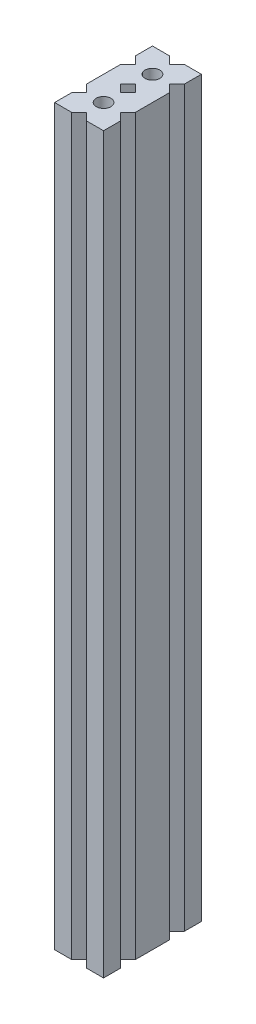
ISO-10303-21;
HEADER;
FILE_DESCRIPTION(('STEP AP214'),'2;1');
FILE_NAME('part.step','',(''),(''),'','','');
FILE_SCHEMA(('AUTOMOTIVE_DESIGN { 1 0 10303 214 1 1 1 1 }'));
ENDSEC;
DATA;
#1=APPLICATION_CONTEXT('core data for automotive mechanical design processes');
#2=APPLICATION_PROTOCOL_DEFINITION('international standard','automotive_design',2000,#1);
#3=PRODUCT_CONTEXT('',#1,'mechanical');
#4=PRODUCT('Part','Part','',(#3));
#5=PRODUCT_RELATED_PRODUCT_CATEGORY('part','',(#4));
#6=PRODUCT_DEFINITION_FORMATION('','',#4);
#7=PRODUCT_DEFINITION_CONTEXT('part definition',#1,'design');
#8=PRODUCT_DEFINITION('design','',#6,#7);
#9=PRODUCT_DEFINITION_SHAPE('','',#8);
#10=(LENGTH_UNIT() NAMED_UNIT(*) SI_UNIT(.MILLI.,.METRE.));
#11=(NAMED_UNIT(*) PLANE_ANGLE_UNIT() SI_UNIT($,.RADIAN.));
#12=(NAMED_UNIT(*) SI_UNIT($,.STERADIAN.) SOLID_ANGLE_UNIT());
#13=UNCERTAINTY_MEASURE_WITH_UNIT(LENGTH_MEASURE(1.E-05),#10,'distance_accuracy_value','');
#14=(GEOMETRIC_REPRESENTATION_CONTEXT(3) GLOBAL_UNCERTAINTY_ASSIGNED_CONTEXT((#13)) GLOBAL_UNIT_ASSIGNED_CONTEXT((#10,
#11,#12)) REPRESENTATION_CONTEXT('',''));
#15=CARTESIAN_POINT('',(0.,0.,0.));
#16=DIRECTION('',(0.,0.,1.));
#17=DIRECTION('',(1.,0.,0.));
#18=AXIS2_PLACEMENT_3D('',#15,#16,#17);
#19=CARTESIAN_POINT('',(20.,300.,0.));
#20=DIRECTION('',(0.,0.,-1.));
#21=DIRECTION('',(-1.,0.,0.));
#22=AXIS2_PLACEMENT_3D('',#19,#20,#21);
#23=PLANE('',#22);
#24=DIRECTION('',(0.,1.,0.));
#25=VECTOR('',#24,1.);
#26=CARTESIAN_POINT('',(7.,0.,0.));
#27=LINE('',#26,#25);
#28=CARTESIAN_POINT('',(7.,0.,0.));
#29=VERTEX_POINT('',#28);
#30=CARTESIAN_POINT('',(7.,300.,0.));
#31=VERTEX_POINT('',#30);
#32=EDGE_CURVE('E334',#29,#31,#27,.T.);
#33=ORIENTED_EDGE('',*,*,#32,.T.);
#34=DIRECTION('',(1.,0.,0.));
#35=VECTOR('',#34,1.);
#36=CARTESIAN_POINT('',(20.,300.,0.));
#37=LINE('',#36,#35);
#38=CARTESIAN_POINT('',(0.,300.,0.));
#39=VERTEX_POINT('',#38);
#40=EDGE_CURVE('E262',#39,#31,#37,.T.);
#41=ORIENTED_EDGE('',*,*,#40,.F.);
#42=DIRECTION('',(0.,-1.,0.));
#43=VECTOR('',#42,1.);
#44=CARTESIAN_POINT('',(0.,300.,0.));
#45=LINE('',#44,#43);
#46=CARTESIAN_POINT('',(0.,0.,0.));
#47=VERTEX_POINT('',#46);
#48=EDGE_CURVE('E289',#39,#47,#45,.T.);
#49=ORIENTED_EDGE('',*,*,#48,.T.);
#50=DIRECTION('',(1.,0.,0.));
#51=VECTOR('',#50,1.);
#52=CARTESIAN_POINT('',(20.,0.,0.));
#53=LINE('',#52,#51);
#54=EDGE_CURVE('E236',#47,#29,#53,.T.);
#55=ORIENTED_EDGE('',*,*,#54,.T.);
#56=EDGE_LOOP('',(#33,#41,#49,#55));
#57=FACE_BOUND('',#56,.T.);
#58=ADVANCED_FACE('F35',(#57),#23,.F.);
#59=CARTESIAN_POINT('',(20.,300.,-40.));
#60=DIRECTION('',(-1.,0.,0.));
#61=DIRECTION('',(0.,0.,1.));
#62=AXIS2_PLACEMENT_3D('',#59,#60,#61);
#63=PLANE('',#62);
#64=DIRECTION('',(0.,1.,0.));
#65=VECTOR('',#64,1.);
#66=CARTESIAN_POINT('',(20.,0.,-27.));
#67=LINE('',#66,#65);
#68=CARTESIAN_POINT('',(20.,0.,-27.));
#69=VERTEX_POINT('',#68);
#70=CARTESIAN_POINT('',(20.,300.,-27.));
#71=VERTEX_POINT('',#70);
#72=EDGE_CURVE('E353',#69,#71,#67,.T.);
#73=ORIENTED_EDGE('',*,*,#72,.T.);
#74=DIRECTION('',(0.,0.,-1.));
#75=VECTOR('',#74,1.);
#76=CARTESIAN_POINT('',(20.,300.,-40.));
#77=LINE('',#76,#75);
#78=CARTESIAN_POINT('',(20.,300.,-13.));
#79=VERTEX_POINT('',#78);
#80=EDGE_CURVE('E282',#79,#71,#77,.T.);
#81=ORIENTED_EDGE('',*,*,#80,.F.);
#82=DIRECTION('',(0.,1.,0.));
#83=VECTOR('',#82,1.);
#84=CARTESIAN_POINT('',(20.,0.,-13.));
#85=LINE('',#84,#83);
#86=CARTESIAN_POINT('',(20.,0.,-13.));
#87=VERTEX_POINT('',#86);
#88=EDGE_CURVE('E416',#87,#79,#85,.T.);
#89=ORIENTED_EDGE('',*,*,#88,.F.);
#90=DIRECTION('',(0.,0.,-1.));
#91=VECTOR('',#90,1.);
#92=CARTESIAN_POINT('',(20.,0.,-40.));
#93=LINE('',#92,#91);
#94=EDGE_CURVE('E298',#87,#69,#93,.T.);
#95=ORIENTED_EDGE('',*,*,#94,.T.);
#96=EDGE_LOOP('',(#73,#81,#89,#95));
#97=FACE_BOUND('',#96,.T.);
#98=ADVANCED_FACE('F507',(#97),#63,.F.);
#99=DIRECTION('',(0.,1.,0.));
#100=VECTOR('',#99,1.);
#101=CARTESIAN_POINT('',(20.,0.,-7.00000000000001));
#102=LINE('',#101,#100);
#103=CARTESIAN_POINT('',(20.,0.,-7.00000000000001));
#104=VERTEX_POINT('',#103);
#105=CARTESIAN_POINT('',(20.,300.,-7.00000000000001));
#106=VERTEX_POINT('',#105);
#107=EDGE_CURVE('E406',#104,#106,#102,.T.);
#108=ORIENTED_EDGE('',*,*,#107,.T.);
#109=CARTESIAN_POINT('',(20.,300.,0.));
#110=VERTEX_POINT('',#109);
#111=EDGE_CURVE('E278',#110,#106,#77,.T.);
#112=ORIENTED_EDGE('',*,*,#111,.F.);
#113=DIRECTION('',(0.,-1.,0.));
#114=VECTOR('',#113,1.);
#115=CARTESIAN_POINT('',(20.,300.,0.));
#116=LINE('',#115,#114);
#117=CARTESIAN_POINT('',(20.,0.,0.));
#118=VERTEX_POINT('',#117);
#119=EDGE_CURVE('E11',#110,#118,#116,.T.);
#120=ORIENTED_EDGE('',*,*,#119,.T.);
#121=EDGE_CURVE('E295',#118,#104,#93,.T.);
#122=ORIENTED_EDGE('',*,*,#121,.T.);
#123=EDGE_LOOP('',(#108,#112,#120,#122));
#124=FACE_BOUND('',#123,.T.);
#125=ADVANCED_FACE('F730',(#124),#63,.F.);
#126=CARTESIAN_POINT('',(0.,300.,-40.));
#127=DIRECTION('',(0.,0.,1.));
#128=DIRECTION('',(1.,0.,0.));
#129=AXIS2_PLACEMENT_3D('',#126,#127,#128);
#130=PLANE('',#129);
#131=DIRECTION('',(0.,1.,0.));
#132=VECTOR('',#131,1.);
#133=CARTESIAN_POINT('',(13.,0.,-40.));
#134=LINE('',#133,#132);
#135=CARTESIAN_POINT('',(13.,0.,-40.));
#136=VERTEX_POINT('',#135);
#137=CARTESIAN_POINT('',(13.,300.,-40.));
#138=VERTEX_POINT('',#137);
#139=EDGE_CURVE('E329',#136,#138,#134,.T.);
#140=ORIENTED_EDGE('',*,*,#139,.T.);
#141=DIRECTION('',(-1.,0.,0.));
#142=VECTOR('',#141,1.);
#143=CARTESIAN_POINT('',(0.,300.,-40.));
#144=LINE('',#143,#142);
#145=CARTESIAN_POINT('',(20.,300.,-40.));
#146=VERTEX_POINT('',#145);
#147=EDGE_CURVE('E283',#146,#138,#144,.T.);
#148=ORIENTED_EDGE('',*,*,#147,.F.);
#149=DIRECTION('',(0.,-1.,0.));
#150=VECTOR('',#149,1.);
#151=CARTESIAN_POINT('',(20.,300.,-40.));
#152=LINE('',#151,#150);
#153=CARTESIAN_POINT('',(20.,0.,-40.));
#154=VERTEX_POINT('',#153);
#155=EDGE_CURVE('E44',#146,#154,#152,.T.);
#156=ORIENTED_EDGE('',*,*,#155,.T.);
#157=DIRECTION('',(-1.,0.,0.));
#158=VECTOR('',#157,1.);
#159=CARTESIAN_POINT('',(0.,0.,-40.));
#160=LINE('',#159,#158);
#161=EDGE_CURVE('E239',#154,#136,#160,.T.);
#162=ORIENTED_EDGE('',*,*,#161,.T.);
#163=EDGE_LOOP('',(#140,#148,#156,#162));
#164=FACE_BOUND('',#163,.T.);
#165=ADVANCED_FACE('F319',(#164),#130,.F.);
#166=CARTESIAN_POINT('',(0.,300.,0.));
#167=DIRECTION('',(1.,0.,0.));
#168=DIRECTION('',(0.,0.,-1.));
#169=AXIS2_PLACEMENT_3D('',#166,#167,#168);
#170=PLANE('',#169);
#171=DIRECTION('',(0.,1.,0.));
#172=VECTOR('',#171,1.);
#173=CARTESIAN_POINT('',(0.,0.,-13.));
#174=LINE('',#173,#172);
#175=CARTESIAN_POINT('',(0.,0.,-13.));
#176=VERTEX_POINT('',#175);
#177=CARTESIAN_POINT('',(0.,300.,-13.));
#178=VERTEX_POINT('',#177);
#179=EDGE_CURVE('E411',#176,#178,#174,.T.);
#180=ORIENTED_EDGE('',*,*,#179,.T.);
#181=DIRECTION('',(0.,0.,1.));
#182=VECTOR('',#181,1.);
#183=CARTESIAN_POINT('',(0.,300.,0.));
#184=LINE('',#183,#182);
#185=CARTESIAN_POINT('',(0.,300.,-27.));
#186=VERTEX_POINT('',#185);
#187=EDGE_CURVE('E290',#186,#178,#184,.T.);
#188=ORIENTED_EDGE('',*,*,#187,.F.);
#189=DIRECTION('',(0.,1.,0.));
#190=VECTOR('',#189,1.);
#191=CARTESIAN_POINT('',(0.,0.,-27.));
#192=LINE('',#191,#190);
#193=CARTESIAN_POINT('',(0.,0.,-27.));
#194=VERTEX_POINT('',#193);
#195=EDGE_CURVE('E434',#194,#186,#192,.T.);
#196=ORIENTED_EDGE('',*,*,#195,.F.);
#197=DIRECTION('',(0.,0.,1.));
#198=VECTOR('',#197,1.);
#199=CARTESIAN_POINT('',(0.,0.,0.));
#200=LINE('',#199,#198);
#201=EDGE_CURVE('E238',#194,#176,#200,.T.);
#202=ORIENTED_EDGE('',*,*,#201,.T.);
#203=EDGE_LOOP('',(#180,#188,#196,#202));
#204=FACE_BOUND('',#203,.T.);
#205=ADVANCED_FACE('F471',(#204),#170,.F.);
#206=DIRECTION('',(0.,1.,0.));
#207=VECTOR('',#206,1.);
#208=CARTESIAN_POINT('',(0.,0.,-33.));
#209=LINE('',#208,#207);
#210=CARTESIAN_POINT('',(0.,0.,-33.));
#211=VERTEX_POINT('',#210);
#212=CARTESIAN_POINT('',(0.,300.,-33.));
#213=VERTEX_POINT('',#212);
#214=EDGE_CURVE('E276',#211,#213,#209,.T.);
#215=ORIENTED_EDGE('',*,*,#214,.T.);
#216=CARTESIAN_POINT('',(0.,300.,-40.));
#217=VERTEX_POINT('',#216);
#218=EDGE_CURVE('E286',#217,#213,#184,.T.);
#219=ORIENTED_EDGE('',*,*,#218,.F.);
#220=DIRECTION('',(0.,-1.,0.));
#221=VECTOR('',#220,1.);
#222=CARTESIAN_POINT('',(0.,300.,-40.));
#223=LINE('',#222,#221);
#224=CARTESIAN_POINT('',(0.,0.,-40.));
#225=VERTEX_POINT('',#224);
#226=EDGE_CURVE('E321',#217,#225,#223,.T.);
#227=ORIENTED_EDGE('',*,*,#226,.T.);
#228=EDGE_CURVE('E241',#225,#211,#200,.T.);
#229=ORIENTED_EDGE('',*,*,#228,.T.);
#230=EDGE_LOOP('',(#215,#219,#227,#229));
#231=FACE_BOUND('',#230,.T.);
#232=ADVANCED_FACE('F443',(#231),#170,.F.);
#233=CARTESIAN_POINT('',(0.,300.,0.));
#234=DIRECTION('',(0.,-1.,0.));
#235=DIRECTION('',(0.,0.,-1.));
#236=AXIS2_PLACEMENT_3D('',#233,#234,#235);
#237=PLANE('',#236);
#238=CARTESIAN_POINT('',(10.,300.,-10.));
#239=DIRECTION('',(0.,-1.,0.));
#240=DIRECTION('',(0.,0.,-1.));
#241=AXIS2_PLACEMENT_3D('',#238,#239,#240);
#242=CIRCLE('',#241,3.);
#243=CARTESIAN_POINT('',(10.,300.,-13.));
#244=VERTEX_POINT('',#243);
#245=EDGE_CURVE('E490',#244,#244,#242,.T.);
#246=ORIENTED_EDGE('',*,*,#245,.T.);
#247=EDGE_LOOP('',(#246));
#248=FACE_BOUND('',#247,.T.);
#249=CARTESIAN_POINT('',(10.,300.,-30.));
#250=DIRECTION('',(0.,-1.,0.));
#251=DIRECTION('',(0.,0.,1.));
#252=AXIS2_PLACEMENT_3D('',#249,#250,#251);
#253=CIRCLE('',#252,3.);
#254=CARTESIAN_POINT('',(10.,300.,-27.));
#255=VERTEX_POINT('',#254);
#256=EDGE_CURVE('E844',#255,#255,#253,.T.);
#257=ORIENTED_EDGE('',*,*,#256,.T.);
#258=EDGE_LOOP('',(#257));
#259=FACE_BOUND('',#258,.T.);
#260=DIRECTION('',(-0.707106781186549,0.,0.707106781186546));
#261=VECTOR('',#260,1.);
#262=CARTESIAN_POINT('',(-3.50000000000002,300.,-3.50000000000004));
#263=LINE('',#262,#261);
#264=CARTESIAN_POINT('',(13.,300.,-20.));
#265=VERTEX_POINT('',#264);
#266=CARTESIAN_POINT('',(10.,300.,-17.));
#267=VERTEX_POINT('',#266);
#268=EDGE_CURVE('E51',#265,#267,#263,.T.);
#269=ORIENTED_EDGE('',*,*,#268,.T.);
#270=DIRECTION('',(0.707106781186548,0.,0.707106781186547));
#271=VECTOR('',#270,1.);
#272=CARTESIAN_POINT('',(13.5,300.,-13.5));
#273=LINE('',#272,#271);
#274=CARTESIAN_POINT('',(7.,300.,-20.));
#275=VERTEX_POINT('',#274);
#276=EDGE_CURVE('E369',#275,#267,#273,.T.);
#277=ORIENTED_EDGE('',*,*,#276,.F.);
#278=DIRECTION('',(0.707106781186546,0.,-0.707106781186549));
#279=VECTOR('',#278,1.);
#280=CARTESIAN_POINT('',(-6.49999999999998,300.,-6.49999999999994));
#281=LINE('',#280,#279);
#282=CARTESIAN_POINT('',(10.,300.,-23.));
#283=VERTEX_POINT('',#282);
#284=EDGE_CURVE('E384',#275,#283,#281,.T.);
#285=ORIENTED_EDGE('',*,*,#284,.T.);
#286=DIRECTION('',(-0.707106781186546,0.,-0.707106781186549));
#287=VECTOR('',#286,1.);
#288=CARTESIAN_POINT('',(16.5,300.,-16.5));
#289=LINE('',#288,#287);
#290=EDGE_CURVE('E380',#265,#283,#289,.T.);
#291=ORIENTED_EDGE('',*,*,#290,.F.);
#292=EDGE_LOOP('',(#269,#277,#285,#291));
#293=FACE_BOUND('',#292,.T.);
#294=DIRECTION('',(-0.707106781186547,0.,0.707106781186548));
#295=VECTOR('',#294,1.);
#296=CARTESIAN_POINT('',(-13.5,300.,-13.5));
#297=LINE('',#296,#295);
#298=CARTESIAN_POINT('',(10.,300.,-37.));
#299=VERTEX_POINT('',#298);
#300=EDGE_CURVE('E331',#138,#299,#297,.T.);
#301=ORIENTED_EDGE('',*,*,#300,.T.);
#302=DIRECTION('',(0.707106781186547,0.,0.707106781186548));
#303=VECTOR('',#302,1.);
#304=CARTESIAN_POINT('',(23.5,300.,-23.5));
#305=LINE('',#304,#303);
#306=CARTESIAN_POINT('',(6.99999999999999,300.,-40.));
#307=VERTEX_POINT('',#306);
#308=EDGE_CURVE('E327',#307,#299,#305,.T.);
#309=ORIENTED_EDGE('',*,*,#308,.F.);
#310=EDGE_CURVE('E281',#307,#217,#144,.T.);
#311=ORIENTED_EDGE('',*,*,#310,.T.);
#312=ORIENTED_EDGE('',*,*,#218,.T.);
#313=DIRECTION('',(0.707106781186549,0.,0.707106781186546));
#314=VECTOR('',#313,1.);
#315=CARTESIAN_POINT('',(16.5,300.,-16.5));
#316=LINE('',#315,#314);
#317=CARTESIAN_POINT('',(3.,300.,-30.));
#318=VERTEX_POINT('',#317);
#319=EDGE_CURVE('E341',#213,#318,#316,.T.);
#320=ORIENTED_EDGE('',*,*,#319,.T.);
#321=DIRECTION('',(0.707106781186548,0.,-0.707106781186547));
#322=VECTOR('',#321,1.);
#323=CARTESIAN_POINT('',(-13.5,300.,-13.5));
#324=LINE('',#323,#322);
#325=EDGE_CURVE('E425',#186,#318,#324,.T.);
#326=ORIENTED_EDGE('',*,*,#325,.F.);
#327=ORIENTED_EDGE('',*,*,#187,.T.);
#328=DIRECTION('',(0.707106781186548,0.,0.707106781186547));
#329=VECTOR('',#328,1.);
#330=CARTESIAN_POINT('',(6.5,300.,-6.5));
#331=LINE('',#330,#329);
#332=CARTESIAN_POINT('',(3.,300.,-10.));
#333=VERTEX_POINT('',#332);
#334=EDGE_CURVE('E220',#178,#333,#331,.T.);
#335=ORIENTED_EDGE('',*,*,#334,.T.);
#336=DIRECTION('',(0.707106781186549,0.,-0.707106781186546));
#337=VECTOR('',#336,1.);
#338=CARTESIAN_POINT('',(-3.5,300.,-3.50000000000001));
#339=LINE('',#338,#337);
#340=CARTESIAN_POINT('',(0.,300.,-7.));
#341=VERTEX_POINT('',#340);
#342=EDGE_CURVE('E463',#341,#333,#339,.T.);
#343=ORIENTED_EDGE('',*,*,#342,.F.);
#344=EDGE_CURVE('E228',#341,#39,#184,.T.);
#345=ORIENTED_EDGE('',*,*,#344,.T.);
#346=ORIENTED_EDGE('',*,*,#40,.T.);
#347=DIRECTION('',(0.707106781186547,0.,-0.707106781186548));
#348=VECTOR('',#347,1.);
#349=CARTESIAN_POINT('',(3.5,300.,3.5));
#350=LINE('',#349,#348);
#351=CARTESIAN_POINT('',(10.,300.,-3.));
#352=VERTEX_POINT('',#351);
#353=EDGE_CURVE('E461',#31,#352,#350,.T.);
#354=ORIENTED_EDGE('',*,*,#353,.T.);
#355=DIRECTION('',(-0.707106781186547,0.,-0.707106781186548));
#356=VECTOR('',#355,1.);
#357=CARTESIAN_POINT('',(6.50000000000001,300.,-6.5));
#358=LINE('',#357,#356);
#359=CARTESIAN_POINT('',(13.,300.,0.));
#360=VERTEX_POINT('',#359);
#361=EDGE_CURVE('E486',#360,#352,#358,.T.);
#362=ORIENTED_EDGE('',*,*,#361,.F.);
#363=EDGE_CURVE('E253',#360,#110,#37,.T.);
#364=ORIENTED_EDGE('',*,*,#363,.T.);
#365=ORIENTED_EDGE('',*,*,#111,.T.);
#366=DIRECTION('',(-0.707106781186548,0.,-0.707106781186547));
#367=VECTOR('',#366,1.);
#368=CARTESIAN_POINT('',(13.5,300.,-13.5));
#369=LINE('',#368,#367);
#370=CARTESIAN_POINT('',(17.,300.,-10.));
#371=VERTEX_POINT('',#370);
#372=EDGE_CURVE('E407',#106,#371,#369,.T.);
#373=ORIENTED_EDGE('',*,*,#372,.T.);
#374=DIRECTION('',(-0.707106781186548,0.,0.707106781186547));
#375=VECTOR('',#374,1.);
#376=CARTESIAN_POINT('',(3.49999999999998,300.,3.49999999999999));
#377=LINE('',#376,#375);
#378=EDGE_CURVE('E403',#79,#371,#377,.T.);
#379=ORIENTED_EDGE('',*,*,#378,.F.);
#380=ORIENTED_EDGE('',*,*,#80,.T.);
#381=DIRECTION('',(-0.707106781186548,0.,-0.707106781186547));
#382=VECTOR('',#381,1.);
#383=CARTESIAN_POINT('',(23.5,300.,-23.5));
#384=LINE('',#383,#382);
#385=CARTESIAN_POINT('',(17.,300.,-30.));
#386=VERTEX_POINT('',#385);
#387=EDGE_CURVE('E354',#71,#386,#384,.T.);
#388=ORIENTED_EDGE('',*,*,#387,.T.);
#389=DIRECTION('',(-0.707106781186548,0.,0.707106781186547));
#390=VECTOR('',#389,1.);
#391=CARTESIAN_POINT('',(-6.50000000000002,300.,-6.50000000000004));
#392=LINE('',#391,#390);
#393=CARTESIAN_POINT('',(20.,300.,-33.));
#394=VERTEX_POINT('',#393);
#395=EDGE_CURVE('E351',#394,#386,#392,.T.);
#396=ORIENTED_EDGE('',*,*,#395,.F.);
#397=EDGE_CURVE('E273',#394,#146,#77,.T.);
#398=ORIENTED_EDGE('',*,*,#397,.T.);
#399=ORIENTED_EDGE('',*,*,#147,.T.);
#400=EDGE_LOOP('',(#301,#309,#311,#312,#320,#326,#327,#335,#343,#345,#346,#354,#362,#364,#365,
#373,#379,#380,#388,#396,#398,#399));
#401=FACE_BOUND('',#400,.T.);
#402=ADVANCED_FACE('F446',(#248,#259,#293,#401),#237,.F.);
#403=CARTESIAN_POINT('',(0.,0.,0.));
#404=DIRECTION('',(0.,-1.,0.));
#405=DIRECTION('',(0.,0.,-1.));
#406=AXIS2_PLACEMENT_3D('',#403,#404,#405);
#407=PLANE('',#406);
#408=CARTESIAN_POINT('',(10.,0.,-10.));
#409=DIRECTION('',(0.,-1.,0.));
#410=DIRECTION('',(0.,0.,-1.));
#411=AXIS2_PLACEMENT_3D('',#408,#409,#410);
#412=CIRCLE('',#411,3.);
#413=CARTESIAN_POINT('',(10.,0.,-13.));
#414=VERTEX_POINT('',#413);
#415=EDGE_CURVE('E847',#414,#414,#412,.T.);
#416=ORIENTED_EDGE('',*,*,#415,.F.);
#417=EDGE_LOOP('',(#416));
#418=FACE_BOUND('',#417,.T.);
#419=CARTESIAN_POINT('',(10.,0.,-30.));
#420=DIRECTION('',(0.,-1.,0.));
#421=DIRECTION('',(0.,0.,1.));
#422=AXIS2_PLACEMENT_3D('',#419,#420,#421);
#423=CIRCLE('',#422,3.);
#424=CARTESIAN_POINT('',(10.,0.,-27.));
#425=VERTEX_POINT('',#424);
#426=EDGE_CURVE('E841',#425,#425,#423,.T.);
#427=ORIENTED_EDGE('',*,*,#426,.F.);
#428=EDGE_LOOP('',(#427));
#429=FACE_BOUND('',#428,.T.);
#430=DIRECTION('',(0.707106781186548,0.,0.707106781186547));
#431=VECTOR('',#430,1.);
#432=CARTESIAN_POINT('',(13.5,0.,-13.5));
#433=LINE('',#432,#431);
#434=CARTESIAN_POINT('',(7.,0.,-20.));
#435=VERTEX_POINT('',#434);
#436=CARTESIAN_POINT('',(10.,0.,-17.));
#437=VERTEX_POINT('',#436);
#438=EDGE_CURVE('E375',#435,#437,#433,.T.);
#439=ORIENTED_EDGE('',*,*,#438,.T.);
#440=DIRECTION('',(-0.707106781186549,0.,0.707106781186546));
#441=VECTOR('',#440,1.);
#442=CARTESIAN_POINT('',(-3.50000000000002,0.,-3.50000000000004));
#443=LINE('',#442,#441);
#444=CARTESIAN_POINT('',(13.,0.,-20.));
#445=VERTEX_POINT('',#444);
#446=EDGE_CURVE('E366',#445,#437,#443,.T.);
#447=ORIENTED_EDGE('',*,*,#446,.F.);
#448=DIRECTION('',(-0.707106781186546,0.,-0.707106781186549));
#449=VECTOR('',#448,1.);
#450=CARTESIAN_POINT('',(16.5,0.,-16.5));
#451=LINE('',#450,#449);
#452=CARTESIAN_POINT('',(10.,0.,-23.));
#453=VERTEX_POINT('',#452);
#454=EDGE_CURVE('E368',#445,#453,#451,.T.);
#455=ORIENTED_EDGE('',*,*,#454,.T.);
#456=DIRECTION('',(0.707106781186546,0.,-0.707106781186549));
#457=VECTOR('',#456,1.);
#458=CARTESIAN_POINT('',(-6.49999999999998,0.,-6.49999999999994));
#459=LINE('',#458,#457);
#460=EDGE_CURVE('E372',#435,#453,#459,.T.);
#461=ORIENTED_EDGE('',*,*,#460,.F.);
#462=EDGE_LOOP('',(#439,#447,#455,#461));
#463=FACE_BOUND('',#462,.T.);
#464=DIRECTION('',(0.707106781186547,0.,0.707106781186548));
#465=VECTOR('',#464,1.);
#466=CARTESIAN_POINT('',(23.5,0.,-23.5));
#467=LINE('',#466,#465);
#468=CARTESIAN_POINT('',(6.99999999999999,0.,-40.));
#469=VERTEX_POINT('',#468);
#470=CARTESIAN_POINT('',(10.,0.,-37.));
#471=VERTEX_POINT('',#470);
#472=EDGE_CURVE('E325',#469,#471,#467,.T.);
#473=ORIENTED_EDGE('',*,*,#472,.T.);
#474=DIRECTION('',(-0.707106781186547,0.,0.707106781186548));
#475=VECTOR('',#474,1.);
#476=CARTESIAN_POINT('',(-13.5,0.,-13.5));
#477=LINE('',#476,#475);
#478=EDGE_CURVE('E323',#136,#471,#477,.T.);
#479=ORIENTED_EDGE('',*,*,#478,.F.);
#480=ORIENTED_EDGE('',*,*,#161,.F.);
#481=CARTESIAN_POINT('',(20.,0.,-33.));
#482=VERTEX_POINT('',#481);
#483=EDGE_CURVE('E293',#482,#154,#93,.T.);
#484=ORIENTED_EDGE('',*,*,#483,.F.);
#485=DIRECTION('',(-0.707106781186548,0.,0.707106781186547));
#486=VECTOR('',#485,1.);
#487=CARTESIAN_POINT('',(-6.50000000000002,0.,-6.50000000000004));
#488=LINE('',#487,#486);
#489=CARTESIAN_POINT('',(17.,0.,-30.));
#490=VERTEX_POINT('',#489);
#491=EDGE_CURVE('E350',#482,#490,#488,.T.);
#492=ORIENTED_EDGE('',*,*,#491,.T.);
#493=DIRECTION('',(-0.707106781186548,0.,-0.707106781186547));
#494=VECTOR('',#493,1.);
#495=CARTESIAN_POINT('',(23.5,0.,-23.5));
#496=LINE('',#495,#494);
#497=EDGE_CURVE('E347',#69,#490,#496,.T.);
#498=ORIENTED_EDGE('',*,*,#497,.F.);
#499=ORIENTED_EDGE('',*,*,#94,.F.);
#500=DIRECTION('',(-0.707106781186548,0.,0.707106781186547));
#501=VECTOR('',#500,1.);
#502=CARTESIAN_POINT('',(3.49999999999998,0.,3.49999999999999));
#503=LINE('',#502,#501);
#504=CARTESIAN_POINT('',(17.,0.,-10.));
#505=VERTEX_POINT('',#504);
#506=EDGE_CURVE('E402',#87,#505,#503,.T.);
#507=ORIENTED_EDGE('',*,*,#506,.T.);
#508=DIRECTION('',(-0.707106781186548,0.,-0.707106781186547));
#509=VECTOR('',#508,1.);
#510=CARTESIAN_POINT('',(13.5,0.,-13.5));
#511=LINE('',#510,#509);
#512=EDGE_CURVE('E399',#104,#505,#511,.T.);
#513=ORIENTED_EDGE('',*,*,#512,.F.);
#514=ORIENTED_EDGE('',*,*,#121,.F.);
#515=CARTESIAN_POINT('',(13.,0.,0.));
#516=VERTEX_POINT('',#515);
#517=EDGE_CURVE('E294',#516,#118,#53,.T.);
#518=ORIENTED_EDGE('',*,*,#517,.F.);
#519=DIRECTION('',(-0.707106781186547,0.,-0.707106781186548));
#520=VECTOR('',#519,1.);
#521=CARTESIAN_POINT('',(6.50000000000001,0.,-6.5));
#522=LINE('',#521,#520);
#523=CARTESIAN_POINT('',(10.,0.,-3.));
#524=VERTEX_POINT('',#523);
#525=EDGE_CURVE('E485',#516,#524,#522,.T.);
#526=ORIENTED_EDGE('',*,*,#525,.T.);
#527=DIRECTION('',(0.707106781186547,0.,-0.707106781186548));
#528=VECTOR('',#527,1.);
#529=CARTESIAN_POINT('',(3.5,0.,3.5));
#530=LINE('',#529,#528);
#531=EDGE_CURVE('E481',#29,#524,#530,.T.);
#532=ORIENTED_EDGE('',*,*,#531,.F.);
#533=ORIENTED_EDGE('',*,*,#54,.F.);
#534=CARTESIAN_POINT('',(0.,0.,-7.));
#535=VERTEX_POINT('',#534);
#536=EDGE_CURVE('E226',#535,#47,#200,.T.);
#537=ORIENTED_EDGE('',*,*,#536,.F.);
#538=DIRECTION('',(0.707106781186549,0.,-0.707106781186546));
#539=VECTOR('',#538,1.);
#540=CARTESIAN_POINT('',(-3.5,0.,-3.50000000000001));
#541=LINE('',#540,#539);
#542=CARTESIAN_POINT('',(3.,0.,-9.99999999999999));
#543=VERTEX_POINT('',#542);
#544=EDGE_CURVE('E208',#535,#543,#541,.T.);
#545=ORIENTED_EDGE('',*,*,#544,.T.);
#546=DIRECTION('',(0.707106781186548,0.,0.707106781186547));
#547=VECTOR('',#546,1.);
#548=CARTESIAN_POINT('',(6.5,0.,-6.5));
#549=LINE('',#548,#547);
#550=EDGE_CURVE('E219',#176,#543,#549,.T.);
#551=ORIENTED_EDGE('',*,*,#550,.F.);
#552=ORIENTED_EDGE('',*,*,#201,.F.);
#553=DIRECTION('',(0.707106781186548,0.,-0.707106781186547));
#554=VECTOR('',#553,1.);
#555=CARTESIAN_POINT('',(-13.5,0.,-13.5));
#556=LINE('',#555,#554);
#557=CARTESIAN_POINT('',(3.,0.,-30.));
#558=VERTEX_POINT('',#557);
#559=EDGE_CURVE('E424',#194,#558,#556,.T.);
#560=ORIENTED_EDGE('',*,*,#559,.T.);
#561=DIRECTION('',(0.707106781186549,0.,0.707106781186546));
#562=VECTOR('',#561,1.);
#563=CARTESIAN_POINT('',(16.5,0.,-16.5));
#564=LINE('',#563,#562);
#565=EDGE_CURVE('E421',#211,#558,#564,.T.);
#566=ORIENTED_EDGE('',*,*,#565,.F.);
#567=ORIENTED_EDGE('',*,*,#228,.F.);
#568=EDGE_CURVE('E248',#469,#225,#160,.T.);
#569=ORIENTED_EDGE('',*,*,#568,.F.);
#570=EDGE_LOOP('',(#473,#479,#480,#484,#492,#498,#499,#507,#513,#514,#518,#526,#532,#533,#537,
#545,#551,#552,#560,#566,#567,#569));
#571=FACE_BOUND('',#570,.T.);
#572=ADVANCED_FACE('F233',(#418,#429,#463,#571),#407,.T.);
#573=ORIENTED_EDGE('',*,*,#363,.F.);
#574=DIRECTION('',(0.,1.,0.));
#575=VECTOR('',#574,1.);
#576=CARTESIAN_POINT('',(13.,0.,0.));
#577=LINE('',#576,#575);
#578=EDGE_CURVE('E495',#516,#360,#577,.T.);
#579=ORIENTED_EDGE('',*,*,#578,.F.);
#580=ORIENTED_EDGE('',*,*,#517,.T.);
#581=ORIENTED_EDGE('',*,*,#119,.F.);
#582=EDGE_LOOP('',(#573,#579,#580,#581));
#583=FACE_BOUND('',#582,.T.);
#584=ADVANCED_FACE('F37',(#583),#23,.F.);
#585=ORIENTED_EDGE('',*,*,#397,.F.);
#586=DIRECTION('',(0.,1.,0.));
#587=VECTOR('',#586,1.);
#588=CARTESIAN_POINT('',(20.,0.,-33.));
#589=LINE('',#588,#587);
#590=EDGE_CURVE('E314',#482,#394,#589,.T.);
#591=ORIENTED_EDGE('',*,*,#590,.F.);
#592=ORIENTED_EDGE('',*,*,#483,.T.);
#593=ORIENTED_EDGE('',*,*,#155,.F.);
#594=EDGE_LOOP('',(#585,#591,#592,#593));
#595=FACE_BOUND('',#594,.T.);
#596=ADVANCED_FACE('F312',(#595),#63,.F.);
#597=ORIENTED_EDGE('',*,*,#310,.F.);
#598=DIRECTION('',(0.,1.,0.));
#599=VECTOR('',#598,1.);
#600=CARTESIAN_POINT('',(6.99999999999999,0.,-40.));
#601=LINE('',#600,#599);
#602=EDGE_CURVE('E342',#469,#307,#601,.T.);
#603=ORIENTED_EDGE('',*,*,#602,.F.);
#604=ORIENTED_EDGE('',*,*,#568,.T.);
#605=ORIENTED_EDGE('',*,*,#226,.F.);
#606=EDGE_LOOP('',(#597,#603,#604,#605));
#607=FACE_BOUND('',#606,.T.);
#608=ADVANCED_FACE('F452',(#607),#130,.F.);
#609=ORIENTED_EDGE('',*,*,#344,.F.);
#610=DIRECTION('',(0.,1.,0.));
#611=VECTOR('',#610,1.);
#612=CARTESIAN_POINT('',(0.,0.,-7.));
#613=LINE('',#612,#611);
#614=EDGE_CURVE('E212',#535,#341,#613,.T.);
#615=ORIENTED_EDGE('',*,*,#614,.F.);
#616=ORIENTED_EDGE('',*,*,#536,.T.);
#617=ORIENTED_EDGE('',*,*,#48,.F.);
#618=EDGE_LOOP('',(#609,#615,#616,#617));
#619=FACE_BOUND('',#618,.T.);
#620=ADVANCED_FACE('F224',(#619),#170,.F.);
#621=CARTESIAN_POINT('',(16.5,0.,-16.5));
#622=DIRECTION('',(-0.707106781186546,0.,0.707106781186549));
#623=DIRECTION('',(0.707106781186549,0.,0.707106781186546));
#624=AXIS2_PLACEMENT_3D('',#621,#622,#623);
#625=PLANE('',#624);
#626=ORIENTED_EDGE('',*,*,#319,.F.);
#627=ORIENTED_EDGE('',*,*,#214,.F.);
#628=ORIENTED_EDGE('',*,*,#565,.T.);
#629=DIRECTION('',(0.,1.,0.));
#630=VECTOR('',#629,1.);
#631=CARTESIAN_POINT('',(3.,0.,-30.));
#632=LINE('',#631,#630);
#633=EDGE_CURVE('E432',#558,#318,#632,.T.);
#634=ORIENTED_EDGE('',*,*,#633,.T.);
#635=EDGE_LOOP('',(#626,#627,#628,#634));
#636=FACE_BOUND('',#635,.T.);
#637=ADVANCED_FACE('F520',(#636),#625,.T.);
#638=CARTESIAN_POINT('',(-13.5,0.,-13.5));
#639=DIRECTION('',(0.707106781186547,0.,0.707106781186548));
#640=DIRECTION('',(0.707106781186548,0.,-0.707106781186547));
#641=AXIS2_PLACEMENT_3D('',#638,#639,#640);
#642=PLANE('',#641);
#643=ORIENTED_EDGE('',*,*,#325,.T.);
#644=ORIENTED_EDGE('',*,*,#633,.F.);
#645=ORIENTED_EDGE('',*,*,#559,.F.);
#646=ORIENTED_EDGE('',*,*,#195,.T.);
#647=EDGE_LOOP('',(#643,#644,#645,#646));
#648=FACE_BOUND('',#647,.T.);
#649=ADVANCED_FACE('F708',(#648),#642,.F.);
#650=CARTESIAN_POINT('',(3.5,0.,3.5));
#651=DIRECTION('',(0.707106781186548,0.,0.707106781186547));
#652=DIRECTION('',(0.707106781186547,0.,-0.707106781186548));
#653=AXIS2_PLACEMENT_3D('',#650,#651,#652);
#654=PLANE('',#653);
#655=ORIENTED_EDGE('',*,*,#353,.F.);
#656=ORIENTED_EDGE('',*,*,#32,.F.);
#657=ORIENTED_EDGE('',*,*,#531,.T.);
#658=DIRECTION('',(0.,1.,0.));
#659=VECTOR('',#658,1.);
#660=CARTESIAN_POINT('',(10.,0.,-3.));
#661=LINE('',#660,#659);
#662=EDGE_CURVE('E493',#524,#352,#661,.T.);
#663=ORIENTED_EDGE('',*,*,#662,.T.);
#664=EDGE_LOOP('',(#655,#656,#657,#663));
#665=FACE_BOUND('',#664,.T.);
#666=ADVANCED_FACE('F700',(#665),#654,.T.);
#667=CARTESIAN_POINT('',(6.50000000000001,0.,-6.5));
#668=DIRECTION('',(0.707106781186548,0.,-0.707106781186547));
#669=DIRECTION('',(-0.707106781186547,0.,-0.707106781186548));
#670=AXIS2_PLACEMENT_3D('',#667,#668,#669);
#671=PLANE('',#670);
#672=ORIENTED_EDGE('',*,*,#361,.T.);
#673=ORIENTED_EDGE('',*,*,#662,.F.);
#674=ORIENTED_EDGE('',*,*,#525,.F.);
#675=ORIENTED_EDGE('',*,*,#578,.T.);
#676=EDGE_LOOP('',(#672,#673,#674,#675));
#677=FACE_BOUND('',#676,.T.);
#678=ADVANCED_FACE('F693',(#677),#671,.F.);
#679=CARTESIAN_POINT('',(6.5,0.,-6.5));
#680=DIRECTION('',(-0.707106781186547,0.,0.707106781186548));
#681=DIRECTION('',(0.707106781186548,0.,0.707106781186547));
#682=AXIS2_PLACEMENT_3D('',#679,#680,#681);
#683=PLANE('',#682);
#684=ORIENTED_EDGE('',*,*,#334,.F.);
#685=ORIENTED_EDGE('',*,*,#179,.F.);
#686=ORIENTED_EDGE('',*,*,#550,.T.);
#687=DIRECTION('',(0.,1.,0.));
#688=VECTOR('',#687,1.);
#689=CARTESIAN_POINT('',(3.,0.,-10.));
#690=LINE('',#689,#688);
#691=EDGE_CURVE('E214',#543,#333,#690,.T.);
#692=ORIENTED_EDGE('',*,*,#691,.T.);
#693=EDGE_LOOP('',(#684,#685,#686,#692));
#694=FACE_BOUND('',#693,.T.);
#695=ADVANCED_FACE('F533',(#694),#683,.T.);
#696=CARTESIAN_POINT('',(-3.5,0.,-3.50000000000001));
#697=DIRECTION('',(0.707106781186546,0.,0.707106781186549));
#698=DIRECTION('',(0.707106781186549,0.,-0.707106781186546));
#699=AXIS2_PLACEMENT_3D('',#696,#697,#698);
#700=PLANE('',#699);
#701=ORIENTED_EDGE('',*,*,#342,.T.);
#702=ORIENTED_EDGE('',*,*,#691,.F.);
#703=ORIENTED_EDGE('',*,*,#544,.F.);
#704=ORIENTED_EDGE('',*,*,#614,.T.);
#705=EDGE_LOOP('',(#701,#702,#703,#704));
#706=FACE_BOUND('',#705,.T.);
#707=ADVANCED_FACE('F211',(#706),#700,.F.);
#708=CARTESIAN_POINT('',(13.5,0.,-13.5));
#709=DIRECTION('',(0.707106781186547,0.,-0.707106781186548));
#710=DIRECTION('',(-0.707106781186548,0.,-0.707106781186547));
#711=AXIS2_PLACEMENT_3D('',#708,#709,#710);
#712=PLANE('',#711);
#713=ORIENTED_EDGE('',*,*,#372,.F.);
#714=ORIENTED_EDGE('',*,*,#107,.F.);
#715=ORIENTED_EDGE('',*,*,#512,.T.);
#716=DIRECTION('',(0.,1.,0.));
#717=VECTOR('',#716,1.);
#718=CARTESIAN_POINT('',(17.,0.,-10.));
#719=LINE('',#718,#717);
#720=EDGE_CURVE('E381',#505,#371,#719,.T.);
#721=ORIENTED_EDGE('',*,*,#720,.T.);
#722=EDGE_LOOP('',(#713,#714,#715,#721));
#723=FACE_BOUND('',#722,.T.);
#724=ADVANCED_FACE('F532',(#723),#712,.T.);
#725=CARTESIAN_POINT('',(3.49999999999998,0.,3.49999999999999));
#726=DIRECTION('',(-0.707106781186547,0.,-0.707106781186548));
#727=DIRECTION('',(-0.707106781186548,0.,0.707106781186547));
#728=AXIS2_PLACEMENT_3D('',#725,#726,#727);
#729=PLANE('',#728);
#730=ORIENTED_EDGE('',*,*,#378,.T.);
#731=ORIENTED_EDGE('',*,*,#720,.F.);
#732=ORIENTED_EDGE('',*,*,#506,.F.);
#733=ORIENTED_EDGE('',*,*,#88,.T.);
#734=EDGE_LOOP('',(#730,#731,#732,#733));
#735=FACE_BOUND('',#734,.T.);
#736=ADVANCED_FACE('F549',(#735),#729,.F.);
#737=CARTESIAN_POINT('',(-3.50000000000002,0.,-3.50000000000004));
#738=DIRECTION('',(-0.707106781186546,0.,-0.707106781186549));
#739=DIRECTION('',(-0.707106781186549,0.,0.707106781186546));
#740=AXIS2_PLACEMENT_3D('',#737,#738,#739);
#741=PLANE('',#740);
#742=ORIENTED_EDGE('',*,*,#268,.F.);
#743=DIRECTION('',(0.,1.,0.));
#744=VECTOR('',#743,1.);
#745=CARTESIAN_POINT('',(13.,0.,-20.));
#746=LINE('',#745,#744);
#747=EDGE_CURVE('E378',#445,#265,#746,.T.);
#748=ORIENTED_EDGE('',*,*,#747,.F.);
#749=ORIENTED_EDGE('',*,*,#446,.T.);
#750=DIRECTION('',(0.,1.,0.));
#751=VECTOR('',#750,1.);
#752=CARTESIAN_POINT('',(10.,0.,-17.));
#753=LINE('',#752,#751);
#754=EDGE_CURVE('E357',#437,#267,#753,.T.);
#755=ORIENTED_EDGE('',*,*,#754,.T.);
#756=EDGE_LOOP('',(#742,#748,#749,#755));
#757=FACE_BOUND('',#756,.T.);
#758=ADVANCED_FACE('F557',(#757),#741,.T.);
#759=CARTESIAN_POINT('',(13.5,0.,-13.5));
#760=DIRECTION('',(-0.707106781186547,0.,0.707106781186548));
#761=DIRECTION('',(0.707106781186548,0.,0.707106781186547));
#762=AXIS2_PLACEMENT_3D('',#759,#760,#761);
#763=PLANE('',#762);
#764=ORIENTED_EDGE('',*,*,#276,.T.);
#765=ORIENTED_EDGE('',*,*,#754,.F.);
#766=ORIENTED_EDGE('',*,*,#438,.F.);
#767=DIRECTION('',(0.,1.,0.));
#768=VECTOR('',#767,1.);
#769=CARTESIAN_POINT('',(7.,0.,-20.));
#770=LINE('',#769,#768);
#771=EDGE_CURVE('E391',#435,#275,#770,.T.);
#772=ORIENTED_EDGE('',*,*,#771,.T.);
#773=EDGE_LOOP('',(#764,#765,#766,#772));
#774=FACE_BOUND('',#773,.T.);
#775=ADVANCED_FACE('F566',(#774),#763,.F.);
#776=CARTESIAN_POINT('',(-6.49999999999998,0.,-6.49999999999994));
#777=DIRECTION('',(0.707106781186549,0.,0.707106781186546));
#778=DIRECTION('',(0.707106781186546,0.,-0.707106781186549));
#779=AXIS2_PLACEMENT_3D('',#776,#777,#778);
#780=PLANE('',#779);
#781=ORIENTED_EDGE('',*,*,#284,.F.);
#782=ORIENTED_EDGE('',*,*,#771,.F.);
#783=ORIENTED_EDGE('',*,*,#460,.T.);
#784=DIRECTION('',(0.,1.,0.));
#785=VECTOR('',#784,1.);
#786=CARTESIAN_POINT('',(10.,0.,-23.));
#787=LINE('',#786,#785);
#788=EDGE_CURVE('E394',#453,#283,#787,.T.);
#789=ORIENTED_EDGE('',*,*,#788,.T.);
#790=EDGE_LOOP('',(#781,#782,#783,#789));
#791=FACE_BOUND('',#790,.T.);
#792=ADVANCED_FACE('F574',(#791),#780,.T.);
#793=CARTESIAN_POINT('',(16.5,0.,-16.5));
#794=DIRECTION('',(0.707106781186549,0.,-0.707106781186546));
#795=DIRECTION('',(-0.707106781186546,0.,-0.707106781186549));
#796=AXIS2_PLACEMENT_3D('',#793,#794,#795);
#797=PLANE('',#796);
#798=ORIENTED_EDGE('',*,*,#290,.T.);
#799=ORIENTED_EDGE('',*,*,#788,.F.);
#800=ORIENTED_EDGE('',*,*,#454,.F.);
#801=ORIENTED_EDGE('',*,*,#747,.T.);
#802=EDGE_LOOP('',(#798,#799,#800,#801));
#803=FACE_BOUND('',#802,.T.);
#804=ADVANCED_FACE('F582',(#803),#797,.F.);
#805=CARTESIAN_POINT('',(23.5,0.,-23.5));
#806=DIRECTION('',(0.707106781186547,0.,-0.707106781186548));
#807=DIRECTION('',(-0.707106781186548,0.,-0.707106781186547));
#808=AXIS2_PLACEMENT_3D('',#805,#806,#807);
#809=PLANE('',#808);
#810=ORIENTED_EDGE('',*,*,#387,.F.);
#811=ORIENTED_EDGE('',*,*,#72,.F.);
#812=ORIENTED_EDGE('',*,*,#497,.T.);
#813=DIRECTION('',(0.,1.,0.));
#814=VECTOR('',#813,1.);
#815=CARTESIAN_POINT('',(17.,0.,-30.));
#816=LINE('',#815,#814);
#817=EDGE_CURVE('E338',#490,#386,#816,.T.);
#818=ORIENTED_EDGE('',*,*,#817,.T.);
#819=EDGE_LOOP('',(#810,#811,#812,#818));
#820=FACE_BOUND('',#819,.T.);
#821=ADVANCED_FACE('F590',(#820),#809,.T.);
#822=CARTESIAN_POINT('',(-6.50000000000002,0.,-6.50000000000004));
#823=DIRECTION('',(-0.707106781186547,0.,-0.707106781186548));
#824=DIRECTION('',(-0.707106781186548,0.,0.707106781186547));
#825=AXIS2_PLACEMENT_3D('',#822,#823,#824);
#826=PLANE('',#825);
#827=ORIENTED_EDGE('',*,*,#395,.T.);
#828=ORIENTED_EDGE('',*,*,#817,.F.);
#829=ORIENTED_EDGE('',*,*,#491,.F.);
#830=ORIENTED_EDGE('',*,*,#590,.T.);
#831=EDGE_LOOP('',(#827,#828,#829,#830));
#832=FACE_BOUND('',#831,.T.);
#833=ADVANCED_FACE('F599',(#832),#826,.F.);
#834=CARTESIAN_POINT('',(-13.5,0.,-13.5));
#835=DIRECTION('',(-0.707106781186548,0.,-0.707106781186547));
#836=DIRECTION('',(-0.707106781186547,0.,0.707106781186548));
#837=AXIS2_PLACEMENT_3D('',#834,#835,#836);
#838=PLANE('',#837);
#839=ORIENTED_EDGE('',*,*,#300,.F.);
#840=ORIENTED_EDGE('',*,*,#139,.F.);
#841=ORIENTED_EDGE('',*,*,#478,.T.);
#842=DIRECTION('',(0.,1.,0.));
#843=VECTOR('',#842,1.);
#844=CARTESIAN_POINT('',(10.,0.,-37.));
#845=LINE('',#844,#843);
#846=EDGE_CURVE('E59',#471,#299,#845,.T.);
#847=ORIENTED_EDGE('',*,*,#846,.T.);
#848=EDGE_LOOP('',(#839,#840,#841,#847));
#849=FACE_BOUND('',#848,.T.);
#850=ADVANCED_FACE('F608',(#849),#838,.T.);
#851=CARTESIAN_POINT('',(23.5,0.,-23.5));
#852=DIRECTION('',(-0.707106781186548,0.,0.707106781186547));
#853=DIRECTION('',(0.707106781186547,0.,0.707106781186548));
#854=AXIS2_PLACEMENT_3D('',#851,#852,#853);
#855=PLANE('',#854);
#856=ORIENTED_EDGE('',*,*,#308,.T.);
#857=ORIENTED_EDGE('',*,*,#846,.F.);
#858=ORIENTED_EDGE('',*,*,#472,.F.);
#859=ORIENTED_EDGE('',*,*,#602,.T.);
#860=EDGE_LOOP('',(#856,#857,#858,#859));
#861=FACE_BOUND('',#860,.T.);
#862=ADVANCED_FACE('F617',(#861),#855,.F.);
#863=CARTESIAN_POINT('',(10.,300.,-30.));
#864=DIRECTION('',(0.,-1.,0.));
#865=DIRECTION('',(0.,0.,-1.));
#866=AXIS2_PLACEMENT_3D('',#863,#864,#865);
#867=CYLINDRICAL_SURFACE('',#866,3.);
#868=ORIENTED_EDGE('',*,*,#256,.F.);
#869=EDGE_LOOP('',(#868));
#870=FACE_BOUND('',#869,.T.);
#871=ORIENTED_EDGE('',*,*,#426,.T.);
#872=EDGE_LOOP('',(#871));
#873=FACE_BOUND('',#872,.T.);
#874=ADVANCED_FACE('F623',(#870,#873),#867,.F.);
#875=CARTESIAN_POINT('',(10.,300.,-10.));
#876=DIRECTION('',(0.,-1.,0.));
#877=DIRECTION('',(0.,0.,-1.));
#878=AXIS2_PLACEMENT_3D('',#875,#876,#877);
#879=CYLINDRICAL_SURFACE('',#878,3.);
#880=ORIENTED_EDGE('',*,*,#245,.F.);
#881=EDGE_LOOP('',(#880));
#882=FACE_BOUND('',#881,.T.);
#883=ORIENTED_EDGE('',*,*,#415,.T.);
#884=EDGE_LOOP('',(#883));
#885=FACE_BOUND('',#884,.T.);
#886=ADVANCED_FACE('F630',(#882,#885),#879,.F.);
#887=CLOSED_SHELL('',(#58,#98,#125,#165,#205,#232,#402,#572,#584,#596,#608,#620,#637,#649,#666,
#678,#695,#707,#724,#736,#758,#775,#792,#804,#821,#833,#850,#862,#874,#886));
#888=MANIFOLD_SOLID_BREP('B2',#887);
#889=ADVANCED_BREP_SHAPE_REPRESENTATION('',(#18,#888),#14);
#890=SHAPE_DEFINITION_REPRESENTATION(#9,#889);
ENDSEC;
END-ISO-10303-21;
